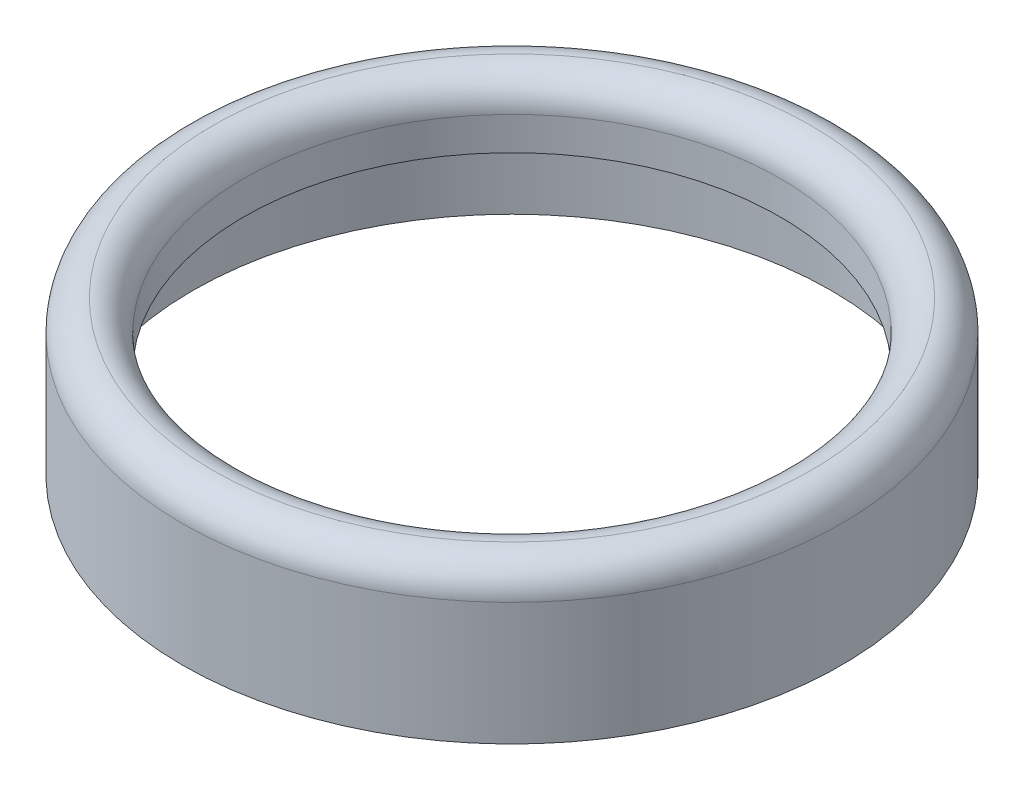
ISO-10303-21;
HEADER;
FILE_DESCRIPTION(('STEP AP214'),'2;1');
FILE_NAME('part.step','',(''),(''),'','','');
FILE_SCHEMA(('AUTOMOTIVE_DESIGN { 1 0 10303 214 1 1 1 1 }'));
ENDSEC;
DATA;
#1=APPLICATION_CONTEXT('core data for automotive mechanical design processes');
#2=APPLICATION_PROTOCOL_DEFINITION('international standard','automotive_design',2000,#1);
#3=PRODUCT_CONTEXT('',#1,'mechanical');
#4=PRODUCT('Part','Part','',(#3));
#5=PRODUCT_RELATED_PRODUCT_CATEGORY('part','',(#4));
#6=PRODUCT_DEFINITION_FORMATION('','',#4);
#7=PRODUCT_DEFINITION_CONTEXT('part definition',#1,'design');
#8=PRODUCT_DEFINITION('design','',#6,#7);
#9=PRODUCT_DEFINITION_SHAPE('','',#8);
#10=(LENGTH_UNIT() NAMED_UNIT(*) SI_UNIT(.MILLI.,.METRE.));
#11=(NAMED_UNIT(*) PLANE_ANGLE_UNIT() SI_UNIT($,.RADIAN.));
#12=(NAMED_UNIT(*) SI_UNIT($,.STERADIAN.) SOLID_ANGLE_UNIT());
#13=UNCERTAINTY_MEASURE_WITH_UNIT(LENGTH_MEASURE(1.E-05),#10,'distance_accuracy_value','');
#14=(GEOMETRIC_REPRESENTATION_CONTEXT(3) GLOBAL_UNCERTAINTY_ASSIGNED_CONTEXT((#13)) GLOBAL_UNIT_ASSIGNED_CONTEXT((#10,
#11,#12)) REPRESENTATION_CONTEXT('',''));
#15=CARTESIAN_POINT('',(0.,0.,0.));
#16=DIRECTION('',(0.,0.,1.));
#17=DIRECTION('',(1.,0.,0.));
#18=AXIS2_PLACEMENT_3D('',#15,#16,#17);
#19=CARTESIAN_POINT('',(0.,-7.,0.));
#20=DIRECTION('',(0.,1.,0.));
#21=DIRECTION('',(0.,0.,1.));
#22=AXIS2_PLACEMENT_3D('',#19,#20,#21);
#23=CYLINDRICAL_SURFACE('',#22,25.8);
#24=CARTESIAN_POINT('',(0.,2.6,0.));
#25=DIRECTION('',(0.,1.,0.));
#26=DIRECTION('',(0.,0.,1.));
#27=AXIS2_PLACEMENT_3D('',#24,#25,#26);
#28=CIRCLE('',#27,25.8);
#29=CARTESIAN_POINT('',(0.,2.6,25.8));
#30=VERTEX_POINT('',#29);
#31=EDGE_CURVE('E10',#30,#30,#28,.F.);
#32=ORIENTED_EDGE('',*,*,#31,.T.);
#33=EDGE_LOOP('',(#32));
#34=FACE_BOUND('',#33,.T.);
#35=CARTESIAN_POINT('',(0.,-7.,0.));
#36=DIRECTION('',(0.,1.,0.));
#37=DIRECTION('',(0.,0.,1.));
#38=AXIS2_PLACEMENT_3D('',#35,#36,#37);
#39=CIRCLE('',#38,25.8);
#40=CARTESIAN_POINT('',(0.,-7.,25.8));
#41=VERTEX_POINT('',#40);
#42=EDGE_CURVE('E47',#41,#41,#39,.T.);
#43=ORIENTED_EDGE('',*,*,#42,.T.);
#44=EDGE_LOOP('',(#43));
#45=FACE_BOUND('',#44,.T.);
#46=ADVANCED_FACE('F35',(#34,#45),#23,.T.);
#47=CARTESIAN_POINT('',(0.,-7.,0.));
#48=DIRECTION('',(0.,1.,0.));
#49=DIRECTION('',(0.,0.,1.));
#50=AXIS2_PLACEMENT_3D('',#47,#48,#49);
#51=PLANE('',#50);
#52=CARTESIAN_POINT('',(0.,-7.,0.));
#53=DIRECTION('',(0.,1.,0.));
#54=DIRECTION('',(0.,0.,1.));
#55=AXIS2_PLACEMENT_3D('',#52,#53,#54);
#56=CIRCLE('',#55,25.);
#57=CARTESIAN_POINT('',(0.,-7.,25.));
#58=VERTEX_POINT('',#57);
#59=EDGE_CURVE('E52',#58,#58,#56,.T.);
#60=ORIENTED_EDGE('',*,*,#59,.T.);
#61=EDGE_LOOP('',(#60));
#62=FACE_BOUND('',#61,.T.);
#63=ORIENTED_EDGE('',*,*,#42,.F.);
#64=EDGE_LOOP('',(#63));
#65=FACE_BOUND('',#64,.T.);
#66=ADVANCED_FACE('F79',(#62,#65),#51,.F.);
#67=CARTESIAN_POINT('',(0.,-7.,0.));
#68=DIRECTION('',(0.,1.,0.));
#69=DIRECTION('',(0.,0.,1.));
#70=AXIS2_PLACEMENT_3D('',#67,#68,#69);
#71=CYLINDRICAL_SURFACE('',#70,25.);
#72=ORIENTED_EDGE('',*,*,#59,.F.);
#73=EDGE_LOOP('',(#72));
#74=FACE_BOUND('',#73,.T.);
#75=CARTESIAN_POINT('',(0.,0.,0.));
#76=DIRECTION('',(0.,1.,0.));
#77=DIRECTION('',(0.,0.,1.));
#78=AXIS2_PLACEMENT_3D('',#75,#76,#77);
#79=CIRCLE('',#78,25.);
#80=CARTESIAN_POINT('',(0.,0.,25.));
#81=VERTEX_POINT('',#80);
#82=EDGE_CURVE('E53',#81,#81,#79,.T.);
#83=ORIENTED_EDGE('',*,*,#82,.T.);
#84=EDGE_LOOP('',(#83));
#85=FACE_BOUND('',#84,.T.);
#86=ADVANCED_FACE('F84',(#74,#85),#71,.F.);
#87=CARTESIAN_POINT('',(0.,0.,0.));
#88=DIRECTION('',(0.,1.,0.));
#89=DIRECTION('',(0.,0.,1.));
#90=AXIS2_PLACEMENT_3D('',#87,#88,#89);
#91=PLANE('',#90);
#92=CARTESIAN_POINT('',(0.,0.,0.));
#93=DIRECTION('',(0.,1.,0.));
#94=DIRECTION('',(0.,0.,1.));
#95=AXIS2_PLACEMENT_3D('',#92,#93,#94);
#96=CIRCLE('',#95,21.);
#97=CARTESIAN_POINT('',(0.,0.,21.));
#98=VERTEX_POINT('',#97);
#99=EDGE_CURVE('E56',#98,#98,#96,.T.);
#100=ORIENTED_EDGE('',*,*,#99,.T.);
#101=EDGE_LOOP('',(#100));
#102=FACE_BOUND('',#101,.T.);
#103=ORIENTED_EDGE('',*,*,#82,.F.);
#104=EDGE_LOOP('',(#103));
#105=FACE_BOUND('',#104,.T.);
#106=ADVANCED_FACE('F75',(#102,#105),#91,.F.);
#107=CARTESIAN_POINT('',(0.,5.,0.));
#108=DIRECTION('',(0.,-1.,0.));
#109=DIRECTION('',(0.,0.,-1.));
#110=AXIS2_PLACEMENT_3D('',#107,#108,#109);
#111=CYLINDRICAL_SURFACE('',#110,21.);
#112=CARTESIAN_POINT('',(0.,2.6,0.));
#113=DIRECTION('',(0.,1.,0.));
#114=DIRECTION('',(0.,0.,1.));
#115=AXIS2_PLACEMENT_3D('',#112,#113,#114);
#116=CIRCLE('',#115,21.);
#117=CARTESIAN_POINT('',(0.,2.6,21.));
#118=VERTEX_POINT('',#117);
#119=EDGE_CURVE('E43',#118,#118,#116,.T.);
#120=ORIENTED_EDGE('',*,*,#119,.T.);
#121=EDGE_LOOP('',(#120));
#122=FACE_BOUND('',#121,.T.);
#123=ORIENTED_EDGE('',*,*,#99,.F.);
#124=EDGE_LOOP('',(#123));
#125=FACE_BOUND('',#124,.T.);
#126=ADVANCED_FACE('F69',(#122,#125),#111,.F.);
#127=CARTESIAN_POINT('',(0.,2.6,0.));
#128=DIRECTION('',(0.,1.,0.));
#129=DIRECTION('',(0.,0.,1.));
#130=AXIS2_PLACEMENT_3D('',#127,#128,#129);
#131=TOROIDAL_SURFACE('',#130,23.4,2.4);
#132=ORIENTED_EDGE('',*,*,#31,.F.);
#133=EDGE_LOOP('',(#132));
#134=FACE_BOUND('',#133,.T.);
#135=CARTESIAN_POINT('',(0.,5.,0.));
#136=DIRECTION('',(0.,1.,0.));
#137=DIRECTION('',(0.,0.,1.));
#138=AXIS2_PLACEMENT_3D('',#135,#136,#137);
#139=CIRCLE('',#138,23.4);
#140=CARTESIAN_POINT('',(0.,5.,23.4));
#141=VERTEX_POINT('',#140);
#142=EDGE_CURVE('E39',#141,#141,#139,.T.);
#143=ORIENTED_EDGE('',*,*,#142,.F.);
#144=EDGE_LOOP('',(#143));
#145=FACE_BOUND('',#144,.T.);
#146=ADVANCED_FACE('F37',(#134,#145),#131,.T.);
#147=CARTESIAN_POINT('',(0.,2.6,0.));
#148=DIRECTION('',(0.,1.,0.));
#149=DIRECTION('',(0.,0.,1.));
#150=AXIS2_PLACEMENT_3D('',#147,#148,#149);
#151=TOROIDAL_SURFACE('',#150,23.4,2.4);
#152=ORIENTED_EDGE('',*,*,#142,.T.);
#153=EDGE_LOOP('',(#152));
#154=FACE_BOUND('',#153,.T.);
#155=ORIENTED_EDGE('',*,*,#119,.F.);
#156=EDGE_LOOP('',(#155));
#157=FACE_BOUND('',#156,.T.);
#158=ADVANCED_FACE('F65',(#154,#157),#151,.T.);
#159=CLOSED_SHELL('',(#46,#66,#86,#106,#126,#146,#158));
#160=MANIFOLD_SOLID_BREP('B2',#159);
#161=ADVANCED_BREP_SHAPE_REPRESENTATION('',(#18,#160),#14);
#162=SHAPE_DEFINITION_REPRESENTATION(#9,#161);
ENDSEC;
END-ISO-10303-21;
